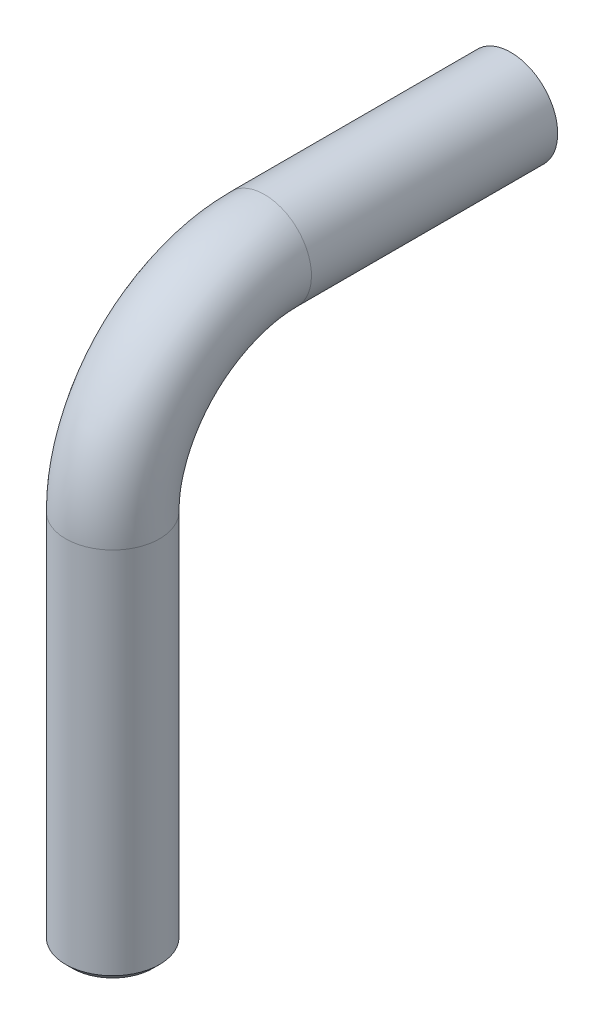
ISO-10303-21;
HEADER;
FILE_DESCRIPTION(('STEP AP214'),'2;1');
FILE_NAME('part.step','',(''),(''),'','','');
FILE_SCHEMA(('AUTOMOTIVE_DESIGN { 1 0 10303 214 1 1 1 1 }'));
ENDSEC;
DATA;
#1=APPLICATION_CONTEXT('core data for automotive mechanical design processes');
#2=APPLICATION_PROTOCOL_DEFINITION('international standard','automotive_design',2000,#1);
#3=PRODUCT_CONTEXT('',#1,'mechanical');
#4=PRODUCT('Part','Part','',(#3));
#5=PRODUCT_RELATED_PRODUCT_CATEGORY('part','',(#4));
#6=PRODUCT_DEFINITION_FORMATION('','',#4);
#7=PRODUCT_DEFINITION_CONTEXT('part definition',#1,'design');
#8=PRODUCT_DEFINITION('design','',#6,#7);
#9=PRODUCT_DEFINITION_SHAPE('','',#8);
#10=(LENGTH_UNIT() NAMED_UNIT(*) SI_UNIT(.MILLI.,.METRE.));
#11=(NAMED_UNIT(*) PLANE_ANGLE_UNIT() SI_UNIT($,.RADIAN.));
#12=(NAMED_UNIT(*) SI_UNIT($,.STERADIAN.) SOLID_ANGLE_UNIT());
#13=UNCERTAINTY_MEASURE_WITH_UNIT(LENGTH_MEASURE(1.E-05),#10,'distance_accuracy_value','');
#14=(GEOMETRIC_REPRESENTATION_CONTEXT(3) GLOBAL_UNCERTAINTY_ASSIGNED_CONTEXT((#13)) GLOBAL_UNIT_ASSIGNED_CONTEXT((#10,
#11,#12)) REPRESENTATION_CONTEXT('',''));
#15=CARTESIAN_POINT('',(0.,0.,0.));
#16=DIRECTION('',(0.,0.,1.));
#17=DIRECTION('',(1.,0.,0.));
#18=AXIS2_PLACEMENT_3D('',#15,#16,#17);
#19=CARTESIAN_POINT('',(7.084,-7.084,0.));
#20=DIRECTION('',(0.,0.,-1.));
#21=DIRECTION('',(-1.,0.,0.));
#22=AXIS2_PLACEMENT_3D('',#19,#20,#21);
#23=PLANE('',#22);
#24=CARTESIAN_POINT('',(-7.,-1.91429941660033E-09,0.));
#25=CARTESIAN_POINT('',(-6.99999891509851,0.196537843364104,0.));
#26=CARTESIAN_POINT('',(-6.99171583277586,0.393111316923906,0.));
#27=CARTESIAN_POINT('',(-6.95863478243086,0.784902996405907,0.));
#28=CARTESIAN_POINT('',(-6.93383193869678,0.980120785012645,0.));
#29=CARTESIAN_POINT('',(-6.86783123658557,1.368089954953,0.));
#30=CARTESIAN_POINT('',(-6.82660735302091,1.56083691741882,0.));
#31=CARTESIAN_POINT('',(-6.7280179483323,1.94232350827592,0.));
#32=CARTESIAN_POINT('',(-6.67063932812044,2.13105975044892,0.));
#33=CARTESIAN_POINT('',(-6.54027609809834,2.50269830515233,0.));
#34=CARTESIAN_POINT('',(-6.46731852835665,2.68561010287559,0.));
#35=CARTESIAN_POINT('',(-6.30622093211251,3.04472057343403,0.));
#36=CARTESIAN_POINT('',(-6.21807404509193,3.22091616867288,0.));
#37=CARTESIAN_POINT('',(-6.02724393962142,3.56526003396931,0.));
#38=CARTESIAN_POINT('',(-5.92456017435632,3.73340800099105,0.));
#39=CARTESIAN_POINT('',(-5.70543879336831,4.06037952617178,0.));
#40=CARTESIAN_POINT('',(-5.58900741164614,4.2192072621471,0.));
#41=CARTESIAN_POINT('',(-5.3431015333083,4.52659138815728,0.));
#42=CARTESIAN_POINT('',(-5.21361865727475,4.67514107487068,0.));
#43=CARTESIAN_POINT('',(-4.94272477354184,4.96066133858248,0.));
#44=CARTESIAN_POINT('',(-4.80132538672348,5.09764294149686,0.));
#45=CARTESIAN_POINT('',(-4.50742847418091,5.35927350480671,0.));
#46=CARTESIAN_POINT('',(-4.35492595010818,5.48391685050972,0.));
#47=CARTESIAN_POINT('',(-4.03992693399899,5.71994163914791,0.));
#48=CARTESIAN_POINT('',(-3.87742813542729,5.83132000379004,0.));
#49=CARTESIAN_POINT('',(-3.54368055722162,6.0399539706526,0.));
#50=CARTESIAN_POINT('',(-3.37243475130826,6.13721432993625,0.));
#51=CARTESIAN_POINT('',(-3.02229506377335,6.31699903732685,0.));
#52=CARTESIAN_POINT('',(-2.84339838718572,6.3995179421954,0.));
#53=CARTESIAN_POINT('',(-2.47935795885249,6.54916017127648,0.));
#54=CARTESIAN_POINT('',(-2.29421661919292,6.61628936359377,0.));
#55=CARTESIAN_POINT('',(-1.91886742245351,6.73473767043591,0.));
#56=CARTESIAN_POINT('',(-1.72865769506266,6.78605085832031,0.));
#57=CARTESIAN_POINT('',(-1.3446696181136,6.87245049550629,0.));
#58=CARTESIAN_POINT('',(-1.15089275696516,6.90754356003006,0.));
#59=CARTESIAN_POINT('',(-0.760983453149633,6.96129667140605,0.));
#60=CARTESIAN_POINT('',(-0.564849982830857,6.97994926434688,0.));
#61=CARTESIAN_POINT('',(-0.17170886107243,7.0006616332308,0.));
#62=CARTESIAN_POINT('',(0.0252987903672222,7.00272140917389,0.));
#63=CARTESIAN_POINT('',(0.418697806180246,6.99023635643656,0.));
#64=CARTESIAN_POINT('',(0.615089409281938,6.97569904838587,0.));
#65=CARTESIAN_POINT('',(1.00603037545227,6.93012601343414,0.));
#66=CARTESIAN_POINT('',(1.20057895345833,6.89908355153457,0.));
#67=CARTESIAN_POINT('',(1.58629644040987,6.82073151807987,0.));
#68=CARTESIAN_POINT('',(1.77746658655911,6.77342803688245,0.));
#69=CARTESIAN_POINT('',(2.15521567208457,6.66286647679002,0.));
#70=CARTESIAN_POINT('',(2.34179282933049,6.59960230882084,0.));
#71=CARTESIAN_POINT('',(2.70888540741974,6.4576044887307,0.));
#72=CARTESIAN_POINT('',(2.88940303579748,6.37887654340142,0.));
#73=CARTESIAN_POINT('',(3.24322564239427,6.20646673756665,0.));
#74=CARTESIAN_POINT('',(3.4165281632127,6.11277983386307,0.));
#75=CARTESIAN_POINT('',(3.75458414244703,5.91116079729822,0.));
#76=CARTESIAN_POINT('',(3.9193395711717,5.8032319680526,0.));
#77=CARTESIAN_POINT('',(4.23910084322865,5.57393156301064,0.));
#78=CARTESIAN_POINT('',(4.39411106726421,5.45256609603564,0.));
#79=CARTESIAN_POINT('',(4.69350691037047,5.19709115330211,0.));
#80=CARTESIAN_POINT('',(4.83788213146208,5.06296949157914,0.));
#81=CARTESIAN_POINT('',(5.11472568875869,4.78312605908963,0.));
#82=CARTESIAN_POINT('',(5.24720165362922,4.63741183501937,0.));
#83=CARTESIAN_POINT('',(5.49946717453756,4.33527500368971,0.));
#84=CARTESIAN_POINT('',(5.61925097007774,4.1788475866921,0.));
#85=CARTESIAN_POINT('',(5.84520726613122,3.8564618255379,0.));
#86=CARTESIAN_POINT('',(5.95138027859047,3.69050384019727,0.));
#87=CARTESIAN_POINT('',(6.14932029190583,3.35030901850082,0.));
#88=CARTESIAN_POINT('',(6.24109379191638,3.17607596358646,0.));
#89=CARTESIAN_POINT('',(6.40978599467957,2.82019293812676,0.));
#90=CARTESIAN_POINT('',(6.48667880373029,2.63853069360937,0.));
#91=CARTESIAN_POINT('',(6.62480787986965,2.26951545267121,0.));
#92=CARTESIAN_POINT('',(6.68605681771731,2.08216720013533,0.));
#93=CARTESIAN_POINT('',(6.79245876905863,1.70328094510092,0.));
#94=CARTESIAN_POINT('',(6.8376371993455,1.51175007165545,0.));
#95=CARTESIAN_POINT('',(6.91170339676888,1.12560337103086,0.));
#96=CARTESIAN_POINT('',(6.94059596877539,0.930988471181963,0.));
#97=CARTESIAN_POINT('',(6.97415548049398,0.613393017569114,0.));
#98=CARTESIAN_POINT('',(6.98384414946197,0.490921235047915,0.));
#99=CARTESIAN_POINT('',(6.99676674823848,0.245637606525265,0.));
#100=CARTESIAN_POINT('',(7.00000067804701,0.122825760523812,0.));
#101=CARTESIAN_POINT('',(6.999998915033,-0.196537845698365,0.));
#102=CARTESIAN_POINT('',(6.99171583264476,-0.393111319255954,0.));
#103=CARTESIAN_POINT('',(6.95863478216895,-0.784902998727887,0.));
#104=CARTESIAN_POINT('',(6.93383193836967,-0.980120787326772,0.));
#105=CARTESIAN_POINT('',(6.867831236129,-1.36808995724492,0.));
#106=CARTESIAN_POINT('',(6.82660735250015,-1.56083691969639,0.));
#107=CARTESIAN_POINT('',(6.72801794768457,-1.94232351051955,0.));
#108=CARTESIAN_POINT('',(6.67063932740992,-2.13105975267294,0.));
#109=CARTESIAN_POINT('',(6.5402760972641,-2.50269830733243,0.));
#110=CARTESIAN_POINT('',(6.46731852746144,-2.68561010503139,0.));
#111=CARTESIAN_POINT('',(6.30622093109758,-3.04472057553614,0.));
#112=CARTESIAN_POINT('',(6.21807404401827,-3.22091617074562,0.));
#113=CARTESIAN_POINT('',(6.02724393843297,-3.56526003597845,0.));
#114=CARTESIAN_POINT('',(5.92456017311182,-3.73340800296595,0.));
#115=CARTESIAN_POINT('',(5.70543879201484,-4.06037952807361,0.));
#116=CARTESIAN_POINT('',(5.58900741023973,-4.21920726401011,0.));
#117=CARTESIAN_POINT('',(5.34310153179942,-4.52659138993833,0.));
#118=CARTESIAN_POINT('',(5.21361865571633,-4.6751410766086,0.));
#119=CARTESIAN_POINT('',(4.9427247718882,-4.96066134023014,0.));
#120=CARTESIAN_POINT('',(4.80132538502416,-5.09764294309741,0.));
#121=CARTESIAN_POINT('',(4.50742847239436,-5.35927350630929,0.));
#122=CARTESIAN_POINT('',(4.35492594828011,-5.48391685196144,0.));
#123=CARTESIAN_POINT('',(4.03992693209229,-5.71994164049459,0.));
#124=CARTESIAN_POINT('',(3.87742813348349,-5.83132000508253,0.));
#125=CARTESIAN_POINT('',(3.5436805552083,-6.03995397183382,0.));
#126=CARTESIAN_POINT('',(3.37243474926254,-6.13721433106039,0.));
#127=CARTESIAN_POINT('',(3.02229506166771,-6.31699903833427,0.));
#128=CARTESIAN_POINT('',(2.84339838505258,-6.39951794314319,0.));
#129=CARTESIAN_POINT('',(2.47935795666947,-6.54916017210292,0.));
#130=CARTESIAN_POINT('',(2.29421661698751,-6.61628936435851,0.));
#131=CARTESIAN_POINT('',(1.91886742020861,-6.73473767107553,0.));
#132=CARTESIAN_POINT('',(1.72865769280065,-6.78605085889653,0.));
#133=CARTESIAN_POINT('',(1.34466961582279,-6.87245049595451,0.));
#134=CARTESIAN_POINT('',(1.15089275466264,-6.90754356041369,0.));
#135=CARTESIAN_POINT('',(0.760983450829197,-6.96129667165971,0.));
#136=CARTESIAN_POINT('',(0.564849980504203,-6.97994926453516,0.));
#137=CARTESIAN_POINT('',(0.171708858738871,-7.00066163328804,0.));
#138=CARTESIAN_POINT('',(-0.0252987927014662,-7.00272140916546,0.));
#139=CARTESIAN_POINT('',(-0.418697808510325,-6.99023635629699,0.));
#140=CARTESIAN_POINT('',(-0.61508941160717,-6.97569904818084,0.));
#141=CARTESIAN_POINT('',(-1.00603037776231,-6.9301260130988,0.));
#142=CARTESIAN_POINT('',(-1.20057895575801,-6.89908355113438,0.));
#143=CARTESIAN_POINT('',(-1.58629644268342,-6.82073151755111,0.));
#144=CARTESIAN_POINT('',(-1.77746658881689,-6.77342803628997,0.));
#145=CARTESIAN_POINT('',(-2.1552156743055,-6.66286647607163,0.));
#146=CARTESIAN_POINT('',(-2.34179283153034,-6.59960230804025,0.));
#147=CARTESIAN_POINT('',(-2.70888540957226,-6.45760448782775,0.));
#148=CARTESIAN_POINT('',(-2.88940303792377,-6.37887654243829,0.));
#149=CARTESIAN_POINT('',(-3.24322564446312,-6.20646673648556,0.));
#150=CARTESIAN_POINT('',(-3.41652816525035,-6.11277983272419,0.));
#151=CARTESIAN_POINT('',(-3.75458414441752,-5.91116079604663,0.));
#152=CARTESIAN_POINT('',(-3.91933957310624,-5.80323196674606,0.));
#153=CARTESIAN_POINT('',(-4.23910084508675,-5.57393156159751,0.));
#154=CARTESIAN_POINT('',(-4.39411106908182,-5.45256609457086,0.));
#155=CARTESIAN_POINT('',(-4.69350691210287,-5.19709115173757,0.));
#156=CARTESIAN_POINT('',(-4.83788213314975,-5.06296948996649,0.));
#157=CARTESIAN_POINT('',(-5.11472569035307,-4.78312605738471,0.));
#158=CARTESIAN_POINT('',(-5.24720165517504,-4.63741183327029,0.));
#159=CARTESIAN_POINT('',(-5.49946717598268,-4.33527500185652,0.));
#160=CARTESIAN_POINT('',(-5.61925097147072,-4.17884758481897,0.));
#161=CARTESIAN_POINT('',(-5.84520726741674,-3.85646182358945,0.));
#162=CARTESIAN_POINT('',(-5.95138027982067,-3.69050383821343,0.));
#163=CARTESIAN_POINT('',(-6.1493202930226,-3.35030901645102,0.));
#164=CARTESIAN_POINT('',(-6.24109379297507,-3.17607596150609,0.));
#165=CARTESIAN_POINT('',(-6.40978599561984,-2.82019293598972,0.));
#166=CARTESIAN_POINT('',(-6.48667880461019,-2.63853069144623,0.));
#167=CARTESIAN_POINT('',(-6.62480788062685,-2.26951545046096,0.));
#168=CARTESIAN_POINT('',(-6.68605681841218,-2.08216719790408,0.));
#169=CARTESIAN_POINT('',(-6.79245876962708,-1.70328094283398,0.));
#170=CARTESIAN_POINT('',(-6.83763719984994,-1.51175006937385,0.));
#171=CARTESIAN_POINT('',(-6.9117033971443,-1.1256033687255,0.));
#172=CARTESIAN_POINT('',(-6.94059596908581,-0.930988468867508,0.));
#173=CARTESIAN_POINT('',(-6.97415548061672,-0.613393016017886,0.));
#174=CARTESIAN_POINT('',(-6.98384414950289,-0.490921234271224,0.));
#175=CARTESIAN_POINT('',(-6.99676674819756,-0.245637607301956,0.));
#176=CARTESIAN_POINT('',(-7.00000067800606,-0.12282576207935,0.));
#177=CARTESIAN_POINT('',(-7.,-1.91429941660033E-09,0.));
#178=B_SPLINE_CURVE_WITH_KNOTS('',3,(#24,#25,#26,#27,#28,#29,#30,#31,#32,#33,#34,#35,#36,#37,
#38,#39,#40,#41,#42,#43,#44,#45,#46,#47,#48,#49,#50,#51,#52,#53,#54,#55,#56,#57,#58,#59,#60,#61,
#62,#63,#64,#65,#66,#67,#68,#69,#70,#71,#72,#73,#74,#75,#76,#77,#78,#79,#80,#81,#82,#83,#84,#85,
#86,#87,#88,#89,#90,#91,#92,#93,#94,#95,#96,#97,#98,#99,#100,#101,#102,#103,#104,#105,#106,#107,
#108,#109,#110,#111,#112,#113,#114,#115,#116,#117,#118,#119,#120,#121,#122,#123,#124,#125,#126,
#127,#128,#129,#130,#131,#132,#133,#134,#135,#136,#137,#138,#139,#140,#141,#142,#143,#144,#145,
#146,#147,#148,#149,#150,#151,#152,#153,#154,#155,#156,#157,#158,#159,#160,#161,#162,#163,#164,
#165,#166,#167,#168,#169,#170,#171,#172,#173,#174,#175,#176,#177),.UNSPECIFIED.,.T.,.F.,(4,2,2,
2,2,2,2,2,2,2,2,2,2,2,2,2,2,2,2,2,2,2,2,2,2,2,2,2,2,2,2,2,2,2,2,2,2,2,2,2,2,2,2,2,2,2,2,2,2,2,2,
2,2,2,2,2,2,2,2,2,2,2,2,2,2,2,2,2,2,2,2,2,2,2,2,2,4),(0.,0.58950107109514,1.17917620715641,
1.76978964293131,2.36088336442639,2.95095935678712,3.54130256912935,4.13166799356071,
4.72176673135701,5.31224677154243,5.90215750003368,6.49233545313817,7.08265009813346,
7.67276537252193,8.26309809685945,8.85320535127168,9.44353346509982,10.0336206063469,
10.6239751485653,11.2143296907838,11.8044168320308,12.394744945859,12.9848522002713,
13.5751849246088,14.1653001989972,14.7556148439924,15.3457927970968,15.9357035255881,
16.5261835657737,17.1162823035699,17.7066477280012,18.2969909403435,18.8870669327043,
19.4781606541979,20.068774089971,20.6584492260334,21.2479502971307,21.6163572954431,
21.9847642937555,22.5742653648527,23.1639405009151,23.7545539366883,24.3456476581818,
24.9357236505426,25.5260668628849,26.1164322873162,26.7065310251125,27.297011065298,
27.8869217937893,28.4770997468937,29.0674143918889,29.6575296662774,30.2478623906149,
30.8379696450271,31.4282977588553,32.0183849001023,32.6087394423208,33.1990939845393,
33.7891811257863,34.3795092396144,34.9696164940267,35.5599492183642,36.1500644927527,
36.740379137748,37.3305570908525,37.9204678193437,38.5109478595291,39.1010465973254,
39.6914120217568,40.281755234099,40.8718312264597,41.4629249479548,42.0535383837297,
42.643213519791,43.2327145908861,43.601121586866,43.9695285828458),.UNSPECIFIED.);
#179=CARTESIAN_POINT('',(-7.,-1.91429941660033E-09,0.));
#180=VERTEX_POINT('',#179);
#181=EDGE_CURVE('E19',#180,#180,#178,.T.);
#182=ORIENTED_EDGE('',*,*,#181,.T.);
#183=EDGE_LOOP('',(#182));
#184=FACE_BOUND('',#183,.T.);
#185=ADVANCED_FACE('F15',(#184),#23,.T.);
#186=CARTESIAN_POINT('',(-6.072,-78.66233442,53.326220134));
#187=DIRECTION('',(0.,1.,0.));
#188=DIRECTION('',(0.,0.,1.));
#189=AXIS2_PLACEMENT_3D('',#186,#187,#188);
#190=PLANE('',#189);
#191=CARTESIAN_POINT('',(0.,-78.66233442,59.398220134));
#192=DIRECTION('',(0.,1.,0.));
#193=DIRECTION('',(0.,0.,1.));
#194=AXIS2_PLACEMENT_3D('',#191,#192,#193);
#195=CIRCLE('',#194,6.);
#196=CARTESIAN_POINT('',(0.,-78.66233442,65.398220134));
#197=VERTEX_POINT('',#196);
#198=EDGE_CURVE('E48',#197,#197,#195,.F.);
#199=ORIENTED_EDGE('',*,*,#198,.T.);
#200=EDGE_LOOP('',(#199));
#201=FACE_BOUND('',#200,.T.);
#202=ADVANCED_FACE('F66',(#201),#190,.F.);
#203=CARTESIAN_POINT('',(7.,0.,0.));
#204=CARTESIAN_POINT('',(7.,0.,36.735885714));
#205=(BOUNDED_CURVE() B_SPLINE_CURVE(1,(#203,#204),.UNSPECIFIED.,.F.,
.F.) B_SPLINE_CURVE_WITH_KNOTS((2,2),(0.,1.),
.UNSPECIFIED.) CURVE() GEOMETRIC_REPRESENTATION_ITEM() RATIONAL_B_SPLINE_CURVE((1.,1.)) REPRESENTATION_ITEM(''));
#206=CARTESIAN_POINT('',(0.,0.,0.));
#207=DIRECTION('',(0.,0.,1.));
#208=AXIS1_PLACEMENT('',#206,#207);
#209=SURFACE_OF_REVOLUTION('',#205,#208);
#210=CARTESIAN_POINT('',(0.,0.,36.735885714));
#211=DIRECTION('',(0.,0.,-1.));
#212=DIRECTION('',(0.,1.,0.));
#213=AXIS2_PLACEMENT_3D('',#210,#211,#212);
#214=CIRCLE('',#213,7.);
#215=CARTESIAN_POINT('',(0.,7.,36.735885714));
#216=VERTEX_POINT('',#215);
#217=EDGE_CURVE('E38',#216,#216,#214,.F.);
#218=ORIENTED_EDGE('',*,*,#217,.F.);
#219=EDGE_LOOP('',(#218));
#220=FACE_BOUND('',#219,.T.);
#221=ORIENTED_EDGE('',*,*,#181,.F.);
#222=EDGE_LOOP('',(#221));
#223=FACE_BOUND('',#222,.T.);
#224=ADVANCED_FACE('F63',(#220,#223),#209,.T.);
#225=CARTESIAN_POINT('',(0.,-78.66233442,65.398220134));
#226=CARTESIAN_POINT('',(0.,-77.66233442,66.398220134));
#227=(BOUNDED_CURVE() B_SPLINE_CURVE(1,(#225,#226),.UNSPECIFIED.,.F.,
.F.) B_SPLINE_CURVE_WITH_KNOTS((2,2),(0.,1.),
.UNSPECIFIED.) CURVE() GEOMETRIC_REPRESENTATION_ITEM() RATIONAL_B_SPLINE_CURVE((1.,1.)) REPRESENTATION_ITEM(''));
#228=CARTESIAN_POINT('',(0.,-1077.66233442,59.398220134));
#229=DIRECTION('',(0.,1.,0.));
#230=AXIS1_PLACEMENT('',#228,#229);
#231=SURFACE_OF_REVOLUTION('',#227,#230);
#232=CARTESIAN_POINT('',(0.,-77.66233442,59.398220134));
#233=DIRECTION('',(0.,1.,0.));
#234=DIRECTION('',(0.,0.,1.));
#235=AXIS2_PLACEMENT_3D('',#232,#233,#234);
#236=CIRCLE('',#235,7.);
#237=CARTESIAN_POINT('',(0.,-77.66233442,66.398220134));
#238=VERTEX_POINT('',#237);
#239=EDGE_CURVE('E29',#238,#238,#236,.F.);
#240=ORIENTED_EDGE('',*,*,#239,.T.);
#241=EDGE_LOOP('',(#240));
#242=FACE_BOUND('',#241,.T.);
#243=ORIENTED_EDGE('',*,*,#198,.F.);
#244=EDGE_LOOP('',(#243));
#245=FACE_BOUND('',#244,.T.);
#246=ADVANCED_FACE('F65',(#242,#245),#231,.T.);
#247=CARTESIAN_POINT('',(0.,-22.66233442,36.735885714));
#248=DIRECTION('',(1.,0.,0.));
#249=DIRECTION('',(0.,0.,-1.));
#250=AXIS2_PLACEMENT_3D('',#247,#248,#249);
#251=TOROIDAL_SURFACE('',#250,22.66233442,7.);
#252=CARTESIAN_POINT('',(0.,-22.66233442,59.398220134));
#253=DIRECTION('',(0.,1.,0.));
#254=DIRECTION('',(0.,0.,1.));
#255=AXIS2_PLACEMENT_3D('',#252,#253,#254);
#256=CIRCLE('',#255,7.);
#257=CARTESIAN_POINT('',(0.,-22.66233442,66.398220134));
#258=VERTEX_POINT('',#257);
#259=EDGE_CURVE('E10',#258,#258,#256,.T.);
#260=CARTESIAN_POINT('',(0.,-22.66233442,36.735885714));
#261=DIRECTION('',(1.,0.,0.));
#262=DIRECTION('',(0.,0.,-1.));
#263=AXIS2_PLACEMENT_3D('',#260,#261,#262);
#264=CIRCLE('',#263,29.66233442);
#265=EDGE_CURVE('',#216,#258,#264,.T.);
#266=ORIENTED_EDGE('',*,*,#217,.T.);
#267=ORIENTED_EDGE('',*,*,#259,.T.);
#268=ORIENTED_EDGE('',*,*,#265,.T.);
#269=ORIENTED_EDGE('',*,*,#265,.F.);
#270=EDGE_LOOP('',(#266,#268,#267,#269));
#271=FACE_BOUND('',#270,.T.);
#272=ADVANCED_FACE('F17',(#271),#251,.T.);
#273=CARTESIAN_POINT('',(0.,-22.66233442,52.398220134));
#274=CARTESIAN_POINT('',(0.,-77.66233442,52.398220134));
#275=(BOUNDED_CURVE() B_SPLINE_CURVE(1,(#273,#274),.UNSPECIFIED.,.F.,
.F.) B_SPLINE_CURVE_WITH_KNOTS((2,2),(0.,1.),
.UNSPECIFIED.) CURVE() GEOMETRIC_REPRESENTATION_ITEM() RATIONAL_B_SPLINE_CURVE((1.,1.)) REPRESENTATION_ITEM(''));
#276=CARTESIAN_POINT('',(0.,-22.66233442,59.398220134));
#277=DIRECTION('',(0.,-1.,0.));
#278=AXIS1_PLACEMENT('',#276,#277);
#279=SURFACE_OF_REVOLUTION('',#275,#278);
#280=ORIENTED_EDGE('',*,*,#239,.F.);
#281=EDGE_LOOP('',(#280));
#282=FACE_BOUND('',#281,.T.);
#283=ORIENTED_EDGE('',*,*,#259,.F.);
#284=EDGE_LOOP('',(#283));
#285=FACE_BOUND('',#284,.T.);
#286=ADVANCED_FACE('F77',(#282,#285),#279,.T.);
#287=CLOSED_SHELL('',(#185,#202,#224,#246,#272,#286));
#288=MANIFOLD_SOLID_BREP('B1',#287);
#289=ADVANCED_BREP_SHAPE_REPRESENTATION('',(#18,#288),#14);
#290=SHAPE_DEFINITION_REPRESENTATION(#9,#289);
ENDSEC;
END-ISO-10303-21;
